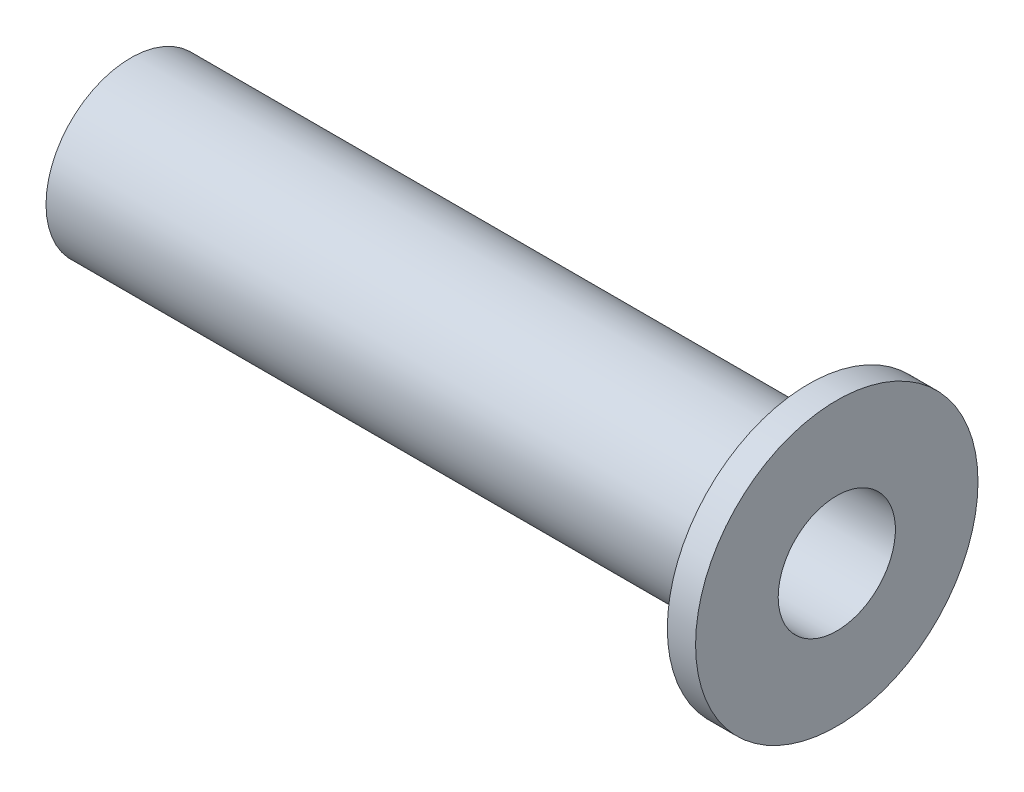
ISO-10303-21;
HEADER;
FILE_DESCRIPTION(('STEP AP214'),'2;1');
FILE_NAME('part.step','',(''),(''),'','','');
FILE_SCHEMA(('AUTOMOTIVE_DESIGN { 1 0 10303 214 1 1 1 1 }'));
ENDSEC;
DATA;
#1=APPLICATION_CONTEXT('core data for automotive mechanical design processes');
#2=APPLICATION_PROTOCOL_DEFINITION('international standard','automotive_design',2000,#1);
#3=PRODUCT_CONTEXT('',#1,'mechanical');
#4=PRODUCT('Part','Part','',(#3));
#5=PRODUCT_RELATED_PRODUCT_CATEGORY('part','',(#4));
#6=PRODUCT_DEFINITION_FORMATION('','',#4);
#7=PRODUCT_DEFINITION_CONTEXT('part definition',#1,'design');
#8=PRODUCT_DEFINITION('design','',#6,#7);
#9=PRODUCT_DEFINITION_SHAPE('','',#8);
#10=(LENGTH_UNIT() NAMED_UNIT(*) SI_UNIT(.MILLI.,.METRE.));
#11=(NAMED_UNIT(*) PLANE_ANGLE_UNIT() SI_UNIT($,.RADIAN.));
#12=(NAMED_UNIT(*) SI_UNIT($,.STERADIAN.) SOLID_ANGLE_UNIT());
#13=UNCERTAINTY_MEASURE_WITH_UNIT(LENGTH_MEASURE(1.E-05),#10,'distance_accuracy_value','');
#14=(GEOMETRIC_REPRESENTATION_CONTEXT(3) GLOBAL_UNCERTAINTY_ASSIGNED_CONTEXT((#13)) GLOBAL_UNIT_ASSIGNED_CONTEXT((#10,
#11,#12)) REPRESENTATION_CONTEXT('',''));
#15=CARTESIAN_POINT('',(0.,0.,0.));
#16=DIRECTION('',(0.,0.,1.));
#17=DIRECTION('',(1.,0.,0.));
#18=AXIS2_PLACEMENT_3D('',#15,#16,#17);
#19=CARTESIAN_POINT('',(-84.1526675500384,4.15,0.));
#20=DIRECTION('',(1.,0.,0.));
#21=DIRECTION('',(0.,0.,-1.));
#22=AXIS2_PLACEMENT_3D('',#19,#20,#21);
#23=PLANE('',#22);
#24=CARTESIAN_POINT('',(-84.1526675500384,0.,0.));
#25=DIRECTION('',(-1.,0.,0.));
#26=DIRECTION('',(0.,0.,1.));
#27=AXIS2_PLACEMENT_3D('',#24,#25,#26);
#28=CIRCLE('',#27,4.15);
#29=CARTESIAN_POINT('',(-84.1526675500384,0.,4.15));
#30=VERTEX_POINT('',#29);
#31=EDGE_CURVE('E52',#30,#30,#28,.T.);
#32=ORIENTED_EDGE('',*,*,#31,.F.);
#33=EDGE_LOOP('',(#32));
#34=FACE_BOUND('',#33,.T.);
#35=CARTESIAN_POINT('',(-84.1526675500384,0.,0.));
#36=DIRECTION('',(-1.,0.,0.));
#37=DIRECTION('',(0.,0.,1.));
#38=AXIS2_PLACEMENT_3D('',#35,#36,#37);
#39=CIRCLE('',#38,6.);
#40=CARTESIAN_POINT('',(-84.1526675500384,0.,6.));
#41=VERTEX_POINT('',#40);
#42=EDGE_CURVE('E10',#41,#41,#39,.T.);
#43=ORIENTED_EDGE('',*,*,#42,.T.);
#44=EDGE_LOOP('',(#43));
#45=FACE_BOUND('',#44,.T.);
#46=ADVANCED_FACE('F30',(#34,#45),#23,.F.);
#47=CARTESIAN_POINT('',(-92.8103493967501,0.,0.));
#48=DIRECTION('',(-1.,0.,0.));
#49=DIRECTION('',(0.,0.,1.));
#50=AXIS2_PLACEMENT_3D('',#47,#48,#49);
#51=CYLINDRICAL_SURFACE('',#50,6.);
#52=ORIENTED_EDGE('',*,*,#42,.F.);
#53=EDGE_LOOP('',(#52));
#54=FACE_BOUND('',#53,.T.);
#55=CARTESIAN_POINT('',(-36.1526675500384,0.,0.));
#56=DIRECTION('',(-1.,0.,0.));
#57=DIRECTION('',(0.,0.,1.));
#58=AXIS2_PLACEMENT_3D('',#55,#56,#57);
#59=CIRCLE('',#58,6.);
#60=CARTESIAN_POINT('',(-36.1526675500384,0.,6.));
#61=VERTEX_POINT('',#60);
#62=EDGE_CURVE('E36',#61,#61,#59,.T.);
#63=ORIENTED_EDGE('',*,*,#62,.T.);
#64=EDGE_LOOP('',(#63));
#65=FACE_BOUND('',#64,.T.);
#66=ADVANCED_FACE('F59',(#54,#65),#51,.T.);
#67=CARTESIAN_POINT('',(-36.1526675500384,10.,0.));
#68=DIRECTION('',(1.,0.,0.));
#69=DIRECTION('',(0.,0.,-1.));
#70=AXIS2_PLACEMENT_3D('',#67,#68,#69);
#71=PLANE('',#70);
#72=ORIENTED_EDGE('',*,*,#62,.F.);
#73=EDGE_LOOP('',(#72));
#74=FACE_BOUND('',#73,.T.);
#75=CARTESIAN_POINT('',(-36.1526675500384,0.,0.));
#76=DIRECTION('',(-1.,0.,0.));
#77=DIRECTION('',(0.,0.,1.));
#78=AXIS2_PLACEMENT_3D('',#75,#76,#77);
#79=CIRCLE('',#78,10.);
#80=CARTESIAN_POINT('',(-36.1526675500384,0.,10.));
#81=VERTEX_POINT('',#80);
#82=EDGE_CURVE('E40',#81,#81,#79,.T.);
#83=ORIENTED_EDGE('',*,*,#82,.T.);
#84=EDGE_LOOP('',(#83));
#85=FACE_BOUND('',#84,.T.);
#86=ADVANCED_FACE('F63',(#74,#85),#71,.F.);
#87=CARTESIAN_POINT('',(-92.8103493967501,0.,0.));
#88=DIRECTION('',(-1.,0.,0.));
#89=DIRECTION('',(0.,0.,1.));
#90=AXIS2_PLACEMENT_3D('',#87,#88,#89);
#91=CYLINDRICAL_SURFACE('',#90,10.);
#92=ORIENTED_EDGE('',*,*,#82,.F.);
#93=EDGE_LOOP('',(#92));
#94=FACE_BOUND('',#93,.T.);
#95=CARTESIAN_POINT('',(-34.1526675500384,0.,0.));
#96=DIRECTION('',(-1.,0.,0.));
#97=DIRECTION('',(0.,0.,1.));
#98=AXIS2_PLACEMENT_3D('',#95,#96,#97);
#99=CIRCLE('',#98,10.);
#100=CARTESIAN_POINT('',(-34.1526675500384,0.,10.));
#101=VERTEX_POINT('',#100);
#102=EDGE_CURVE('E44',#101,#101,#99,.T.);
#103=ORIENTED_EDGE('',*,*,#102,.T.);
#104=EDGE_LOOP('',(#103));
#105=FACE_BOUND('',#104,.T.);
#106=ADVANCED_FACE('F68',(#94,#105),#91,.T.);
#107=CARTESIAN_POINT('',(-34.1526675500384,4.15,0.));
#108=DIRECTION('',(-1.,0.,0.));
#109=DIRECTION('',(0.,0.,1.));
#110=AXIS2_PLACEMENT_3D('',#107,#108,#109);
#111=PLANE('',#110);
#112=ORIENTED_EDGE('',*,*,#102,.F.);
#113=EDGE_LOOP('',(#112));
#114=FACE_BOUND('',#113,.T.);
#115=CARTESIAN_POINT('',(-34.1526675500384,0.,0.));
#116=DIRECTION('',(-1.,0.,0.));
#117=DIRECTION('',(0.,0.,1.));
#118=AXIS2_PLACEMENT_3D('',#115,#116,#117);
#119=CIRCLE('',#118,4.15);
#120=CARTESIAN_POINT('',(-34.1526675500384,0.,4.15));
#121=VERTEX_POINT('',#120);
#122=EDGE_CURVE('E49',#121,#121,#119,.T.);
#123=ORIENTED_EDGE('',*,*,#122,.T.);
#124=EDGE_LOOP('',(#123));
#125=FACE_BOUND('',#124,.T.);
#126=ADVANCED_FACE('F74',(#114,#125),#111,.F.);
#127=CARTESIAN_POINT('',(-92.8103493967501,0.,0.));
#128=DIRECTION('',(-1.,0.,0.));
#129=DIRECTION('',(0.,0.,1.));
#130=AXIS2_PLACEMENT_3D('',#127,#128,#129);
#131=CYLINDRICAL_SURFACE('',#130,4.15);
#132=ORIENTED_EDGE('',*,*,#122,.F.);
#133=EDGE_LOOP('',(#132));
#134=FACE_BOUND('',#133,.T.);
#135=ORIENTED_EDGE('',*,*,#31,.T.);
#136=EDGE_LOOP('',(#135));
#137=FACE_BOUND('',#136,.T.);
#138=ADVANCED_FACE('F56',(#134,#137),#131,.F.);
#139=CLOSED_SHELL('',(#46,#66,#86,#106,#126,#138));
#140=MANIFOLD_SOLID_BREP('B2',#139);
#141=ADVANCED_BREP_SHAPE_REPRESENTATION('',(#18,#140),#14);
#142=SHAPE_DEFINITION_REPRESENTATION(#9,#141);
ENDSEC;
END-ISO-10303-21;
